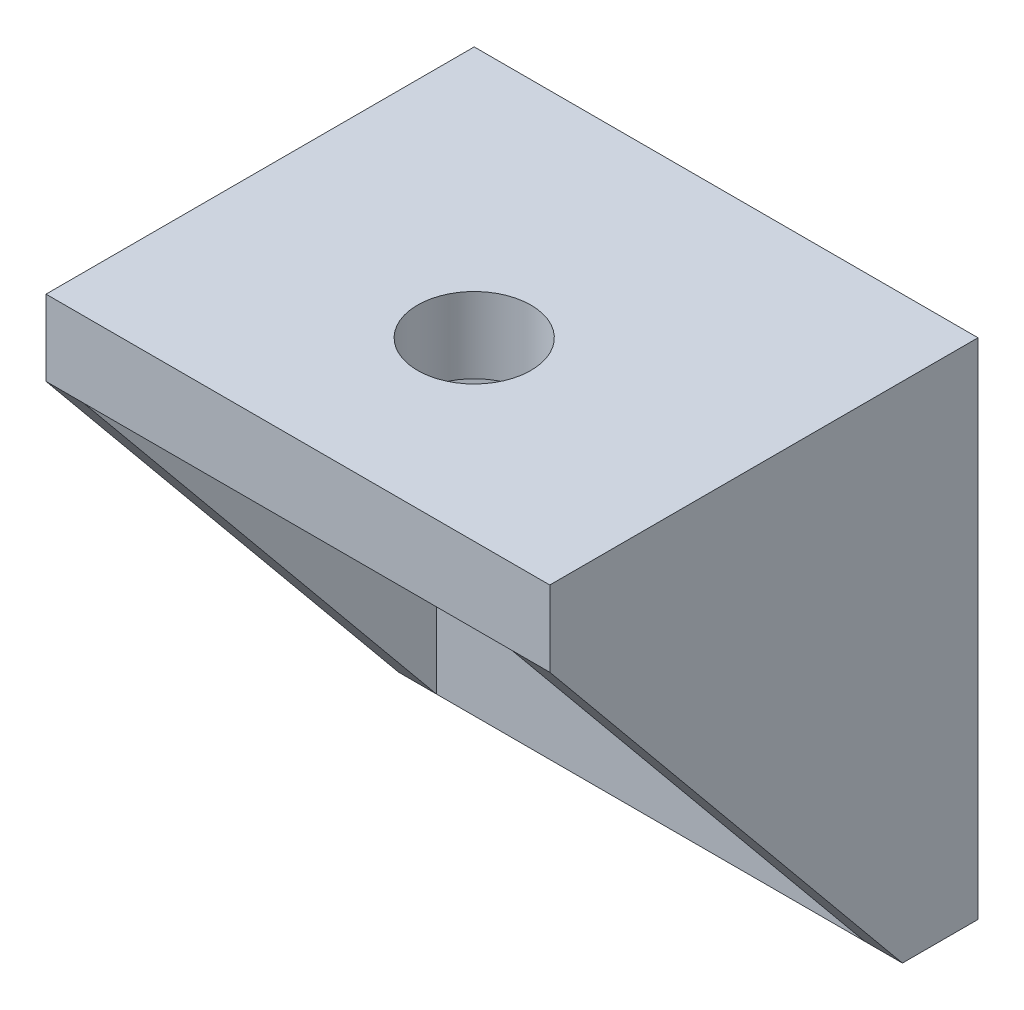
ISO-10303-21;
HEADER;
FILE_DESCRIPTION(('STEP AP214'),'2;1');
FILE_NAME('part.step','',(''),(''),'','','');
FILE_SCHEMA(('AUTOMOTIVE_DESIGN { 1 0 10303 214 1 1 1 1 }'));
ENDSEC;
DATA;
#1=APPLICATION_CONTEXT('core data for automotive mechanical design processes');
#2=APPLICATION_PROTOCOL_DEFINITION('international standard','automotive_design',2000,#1);
#3=PRODUCT_CONTEXT('',#1,'mechanical');
#4=PRODUCT('Part','Part','',(#3));
#5=PRODUCT_RELATED_PRODUCT_CATEGORY('part','',(#4));
#6=PRODUCT_DEFINITION_FORMATION('','',#4);
#7=PRODUCT_DEFINITION_CONTEXT('part definition',#1,'design');
#8=PRODUCT_DEFINITION('design','',#6,#7);
#9=PRODUCT_DEFINITION_SHAPE('','',#8);
#10=(LENGTH_UNIT() NAMED_UNIT(*) SI_UNIT(.MILLI.,.METRE.));
#11=(NAMED_UNIT(*) PLANE_ANGLE_UNIT() SI_UNIT($,.RADIAN.));
#12=(NAMED_UNIT(*) SI_UNIT($,.STERADIAN.) SOLID_ANGLE_UNIT());
#13=UNCERTAINTY_MEASURE_WITH_UNIT(LENGTH_MEASURE(1.E-05),#10,'distance_accuracy_value','');
#14=(GEOMETRIC_REPRESENTATION_CONTEXT(3) GLOBAL_UNCERTAINTY_ASSIGNED_CONTEXT((#13)) GLOBAL_UNIT_ASSIGNED_CONTEXT((#10,
#11,#12)) REPRESENTATION_CONTEXT('',''));
#15=CARTESIAN_POINT('',(0.,0.,0.));
#16=DIRECTION('',(0.,0.,1.));
#17=DIRECTION('',(1.,0.,0.));
#18=AXIS2_PLACEMENT_3D('',#15,#16,#17);
#19=CARTESIAN_POINT('',(-10.,6.99999999999999,17.));
#20=DIRECTION('',(0.,0.6357072528611,-0.77193023561705));
#21=DIRECTION('',(0.,0.77193023561705,0.6357072528611));
#22=AXIS2_PLACEMENT_3D('',#19,#20,#21);
#23=PLANE('',#22);
#24=DIRECTION('',(1.,0.,0.));
#25=VECTOR('',#24,1.);
#26=CARTESIAN_POINT('',(-9.99999999999999,-10.,3.));
#27=LINE('',#26,#25);
#28=CARTESIAN_POINT('',(-9.99999999999999,-10.,3.));
#29=VERTEX_POINT('',#28);
#30=CARTESIAN_POINT('',(-8.5,-10.,3.));
#31=VERTEX_POINT('',#30);
#32=EDGE_CURVE('E138',#29,#31,#27,.T.);
#33=ORIENTED_EDGE('',*,*,#32,.T.);
#34=DIRECTION('',(0.,0.77193023561705,0.6357072528611));
#35=VECTOR('',#34,1.);
#36=CARTESIAN_POINT('',(-8.5,6.99999999999999,17.));
#37=LINE('',#36,#35);
#38=CARTESIAN_POINT('',(-8.5,7.,17.));
#39=VERTEX_POINT('',#38);
#40=EDGE_CURVE('E47',#31,#39,#37,.T.);
#41=ORIENTED_EDGE('',*,*,#40,.T.);
#42=DIRECTION('',(1.,0.,0.));
#43=VECTOR('',#42,1.);
#44=CARTESIAN_POINT('',(-10.,6.99999999999999,17.));
#45=LINE('',#44,#43);
#46=CARTESIAN_POINT('',(-10.,6.99999999999999,17.));
#47=VERTEX_POINT('',#46);
#48=EDGE_CURVE('E150',#47,#39,#45,.T.);
#49=ORIENTED_EDGE('',*,*,#48,.F.);
#50=DIRECTION('',(0.,0.77193023561705,0.6357072528611));
#51=VECTOR('',#50,1.);
#52=CARTESIAN_POINT('',(-10.,6.99999999999999,17.));
#53=LINE('',#52,#51);
#54=EDGE_CURVE('E145',#29,#47,#53,.T.);
#55=ORIENTED_EDGE('',*,*,#54,.F.);
#56=EDGE_LOOP('',(#33,#41,#49,#55));
#57=FACE_BOUND('',#56,.T.);
#58=ADVANCED_FACE('F43',(#57),#23,.F.);
#59=CARTESIAN_POINT('',(10.,10.,17.));
#60=DIRECTION('',(-1.,0.,0.));
#61=DIRECTION('',(0.,-1.,0.));
#62=AXIS2_PLACEMENT_3D('',#59,#60,#61);
#63=PLANE('',#62);
#64=DIRECTION('',(0.,1.,0.));
#65=VECTOR('',#64,1.);
#66=CARTESIAN_POINT('',(10.,10.,17.));
#67=LINE('',#66,#65);
#68=CARTESIAN_POINT('',(10.,7.,17.));
#69=VERTEX_POINT('',#68);
#70=CARTESIAN_POINT('',(10.,10.,17.));
#71=VERTEX_POINT('',#70);
#72=EDGE_CURVE('E154',#69,#71,#67,.T.);
#73=ORIENTED_EDGE('',*,*,#72,.F.);
#74=DIRECTION('',(0.,0.77193023561705,0.6357072528611));
#75=VECTOR('',#74,1.);
#76=CARTESIAN_POINT('',(10.,7.,17.));
#77=LINE('',#76,#75);
#78=CARTESIAN_POINT('',(10.,-10.,3.));
#79=VERTEX_POINT('',#78);
#80=EDGE_CURVE('E208',#79,#69,#77,.T.);
#81=ORIENTED_EDGE('',*,*,#80,.F.);
#82=DIRECTION('',(0.,0.,-1.));
#83=VECTOR('',#82,1.);
#84=CARTESIAN_POINT('',(10.,-10.,17.));
#85=LINE('',#84,#83);
#86=CARTESIAN_POINT('',(10.,-10.,0.));
#87=VERTEX_POINT('',#86);
#88=EDGE_CURVE('E165',#79,#87,#85,.T.);
#89=ORIENTED_EDGE('',*,*,#88,.T.);
#90=DIRECTION('',(0.,1.,0.));
#91=VECTOR('',#90,1.);
#92=CARTESIAN_POINT('',(10.,10.,0.));
#93=LINE('',#92,#91);
#94=CARTESIAN_POINT('',(10.,10.,0.));
#95=VERTEX_POINT('',#94);
#96=EDGE_CURVE('E166',#87,#95,#93,.T.);
#97=ORIENTED_EDGE('',*,*,#96,.T.);
#98=DIRECTION('',(0.,0.,-1.));
#99=VECTOR('',#98,1.);
#100=CARTESIAN_POINT('',(10.,10.,17.));
#101=LINE('',#100,#99);
#102=EDGE_CURVE('E189',#71,#95,#101,.T.);
#103=ORIENTED_EDGE('',*,*,#102,.F.);
#104=EDGE_LOOP('',(#73,#81,#89,#97,#103));
#105=FACE_BOUND('',#104,.T.);
#106=ADVANCED_FACE('F45',(#105),#63,.F.);
#107=CARTESIAN_POINT('',(-10.,10.,17.));
#108=DIRECTION('',(0.,-1.,0.));
#109=DIRECTION('',(0.,0.,-1.));
#110=AXIS2_PLACEMENT_3D('',#107,#108,#109);
#111=PLANE('',#110);
#112=CARTESIAN_POINT('',(0.,10.,10.));
#113=DIRECTION('',(0.,-1.,0.));
#114=DIRECTION('',(0.,0.,-1.));
#115=AXIS2_PLACEMENT_3D('',#112,#113,#114);
#116=CIRCLE('',#115,2.25);
#117=CARTESIAN_POINT('',(0.,10.,7.75));
#118=VERTEX_POINT('',#117);
#119=EDGE_CURVE('E205',#118,#118,#116,.T.);
#120=ORIENTED_EDGE('',*,*,#119,.T.);
#121=EDGE_LOOP('',(#120));
#122=FACE_BOUND('',#121,.T.);
#123=DIRECTION('',(-1.,0.,0.));
#124=VECTOR('',#123,1.);
#125=CARTESIAN_POINT('',(-10.,10.,0.));
#126=LINE('',#125,#124);
#127=CARTESIAN_POINT('',(-10.,10.,0.));
#128=VERTEX_POINT('',#127);
#129=EDGE_CURVE('E170',#95,#128,#126,.T.);
#130=ORIENTED_EDGE('',*,*,#129,.T.);
#131=DIRECTION('',(0.,0.,-1.));
#132=VECTOR('',#131,1.);
#133=CARTESIAN_POINT('',(-10.,10.,17.));
#134=LINE('',#133,#132);
#135=CARTESIAN_POINT('',(-10.,10.,17.));
#136=VERTEX_POINT('',#135);
#137=EDGE_CURVE('E185',#136,#128,#134,.T.);
#138=ORIENTED_EDGE('',*,*,#137,.F.);
#139=DIRECTION('',(-1.,0.,0.));
#140=VECTOR('',#139,1.);
#141=CARTESIAN_POINT('',(-10.,10.,17.));
#142=LINE('',#141,#140);
#143=EDGE_CURVE('E157',#71,#136,#142,.T.);
#144=ORIENTED_EDGE('',*,*,#143,.F.);
#145=ORIENTED_EDGE('',*,*,#102,.T.);
#146=EDGE_LOOP('',(#130,#138,#144,#145));
#147=FACE_BOUND('',#146,.T.);
#148=ADVANCED_FACE('F220',(#122,#147),#111,.F.);
#149=CARTESIAN_POINT('',(-10.,10.,17.));
#150=DIRECTION('',(1.,0.,0.));
#151=DIRECTION('',(0.,0.,-1.));
#152=AXIS2_PLACEMENT_3D('',#149,#150,#151);
#153=PLANE('',#152);
#154=DIRECTION('',(0.,0.,-1.));
#155=VECTOR('',#154,1.);
#156=CARTESIAN_POINT('',(-10.,-10.,17.));
#157=LINE('',#156,#155);
#158=CARTESIAN_POINT('',(-10.,-10.,0.));
#159=VERTEX_POINT('',#158);
#160=EDGE_CURVE('E182',#29,#159,#157,.T.);
#161=ORIENTED_EDGE('',*,*,#160,.F.);
#162=ORIENTED_EDGE('',*,*,#54,.T.);
#163=DIRECTION('',(0.,-1.,0.));
#164=VECTOR('',#163,1.);
#165=CARTESIAN_POINT('',(-10.,10.,17.));
#166=LINE('',#165,#164);
#167=EDGE_CURVE('E161',#136,#47,#166,.T.);
#168=ORIENTED_EDGE('',*,*,#167,.F.);
#169=ORIENTED_EDGE('',*,*,#137,.T.);
#170=DIRECTION('',(0.,-1.,0.));
#171=VECTOR('',#170,1.);
#172=CARTESIAN_POINT('',(-10.,10.,0.));
#173=LINE('',#172,#171);
#174=EDGE_CURVE('E173',#128,#159,#173,.T.);
#175=ORIENTED_EDGE('',*,*,#174,.T.);
#176=EDGE_LOOP('',(#161,#162,#168,#169,#175));
#177=FACE_BOUND('',#176,.T.);
#178=ADVANCED_FACE('F224',(#177),#153,.F.);
#179=CARTESIAN_POINT('',(-10.,-10.,17.));
#180=DIRECTION('',(0.,1.,0.));
#181=DIRECTION('',(0.,0.,1.));
#182=AXIS2_PLACEMENT_3D('',#179,#180,#181);
#183=PLANE('',#182);
#184=ORIENTED_EDGE('',*,*,#88,.F.);
#185=CARTESIAN_POINT('',(8.50000000000001,-10.,3.));
#186=VERTEX_POINT('',#185);
#187=EDGE_CURVE('E140',#186,#79,#27,.T.);
#188=ORIENTED_EDGE('',*,*,#187,.F.);
#189=DIRECTION('',(1.,0.,0.));
#190=VECTOR('',#189,1.);
#191=CARTESIAN_POINT('',(-8.5,-10.,3.));
#192=LINE('',#191,#190);
#193=EDGE_CURVE('E127',#31,#186,#192,.T.);
#194=ORIENTED_EDGE('',*,*,#193,.F.);
#195=ORIENTED_EDGE('',*,*,#32,.F.);
#196=ORIENTED_EDGE('',*,*,#160,.T.);
#197=DIRECTION('',(1.,0.,0.));
#198=VECTOR('',#197,1.);
#199=CARTESIAN_POINT('',(-10.,-10.,0.));
#200=LINE('',#199,#198);
#201=EDGE_CURVE('E158',#159,#87,#200,.T.);
#202=ORIENTED_EDGE('',*,*,#201,.T.);
#203=EDGE_LOOP('',(#184,#188,#194,#195,#196,#202));
#204=FACE_BOUND('',#203,.T.);
#205=ADVANCED_FACE('F137',(#204),#183,.F.);
#206=CARTESIAN_POINT('',(0.,0.,17.));
#207=DIRECTION('',(0.,0.,1.));
#208=DIRECTION('',(1.,0.,0.));
#209=AXIS2_PLACEMENT_3D('',#206,#207,#208);
#210=PLANE('',#209);
#211=ORIENTED_EDGE('',*,*,#48,.T.);
#212=DIRECTION('',(-1.,0.,0.));
#213=VECTOR('',#212,1.);
#214=CARTESIAN_POINT('',(-8.5,7.,17.));
#215=LINE('',#214,#213);
#216=CARTESIAN_POINT('',(8.50000000000001,7.,17.));
#217=VERTEX_POINT('',#216);
#218=EDGE_CURVE('E131',#217,#39,#215,.T.);
#219=ORIENTED_EDGE('',*,*,#218,.F.);
#220=EDGE_CURVE('E68',#217,#69,#45,.T.);
#221=ORIENTED_EDGE('',*,*,#220,.T.);
#222=ORIENTED_EDGE('',*,*,#72,.T.);
#223=ORIENTED_EDGE('',*,*,#143,.T.);
#224=ORIENTED_EDGE('',*,*,#167,.T.);
#225=EDGE_LOOP('',(#211,#219,#221,#222,#223,#224));
#226=FACE_BOUND('',#225,.T.);
#227=ADVANCED_FACE('F217',(#226),#210,.T.);
#228=CARTESIAN_POINT('',(0.,0.,0.));
#229=DIRECTION('',(0.,0.,1.));
#230=DIRECTION('',(1.,0.,0.));
#231=AXIS2_PLACEMENT_3D('',#228,#229,#230);
#232=PLANE('',#231);
#233=CARTESIAN_POINT('',(0.,1.5,0.));
#234=DIRECTION('',(0.,0.,-1.));
#235=DIRECTION('',(-1.,0.,0.));
#236=AXIS2_PLACEMENT_3D('',#233,#234,#235);
#237=CIRCLE('',#236,2.05);
#238=CARTESIAN_POINT('',(-2.05,1.5,0.));
#239=VERTEX_POINT('',#238);
#240=EDGE_CURVE('E11',#239,#239,#237,.T.);
#241=ORIENTED_EDGE('',*,*,#240,.F.);
#242=EDGE_LOOP('',(#241));
#243=FACE_BOUND('',#242,.T.);
#244=ORIENTED_EDGE('',*,*,#96,.F.);
#245=ORIENTED_EDGE('',*,*,#201,.F.);
#246=ORIENTED_EDGE('',*,*,#174,.F.);
#247=ORIENTED_EDGE('',*,*,#129,.F.);
#248=EDGE_LOOP('',(#244,#245,#246,#247));
#249=FACE_BOUND('',#248,.T.);
#250=ADVANCED_FACE('F246',(#243,#249),#232,.F.);
#251=ORIENTED_EDGE('',*,*,#220,.F.);
#252=DIRECTION('',(0.,-0.77193023561705,-0.6357072528611));
#253=VECTOR('',#252,1.);
#254=CARTESIAN_POINT('',(8.50000000000001,7.,17.));
#255=LINE('',#254,#253);
#256=EDGE_CURVE('E121',#217,#186,#255,.T.);
#257=ORIENTED_EDGE('',*,*,#256,.T.);
#258=ORIENTED_EDGE('',*,*,#187,.T.);
#259=ORIENTED_EDGE('',*,*,#80,.T.);
#260=EDGE_LOOP('',(#251,#257,#258,#259));
#261=FACE_BOUND('',#260,.T.);
#262=ADVANCED_FACE('F194',(#261),#23,.F.);
#263=CARTESIAN_POINT('',(-8.5,7.,3.));
#264=DIRECTION('',(-1.,0.,0.));
#265=DIRECTION('',(0.,-1.,0.));
#266=AXIS2_PLACEMENT_3D('',#263,#264,#265);
#267=PLANE('',#266);
#268=DIRECTION('',(0.,-1.,0.));
#269=VECTOR('',#268,1.);
#270=CARTESIAN_POINT('',(-8.5,7.,3.));
#271=LINE('',#270,#269);
#272=CARTESIAN_POINT('',(-8.5,7.,3.));
#273=VERTEX_POINT('',#272);
#274=EDGE_CURVE('E114',#273,#31,#271,.T.);
#275=ORIENTED_EDGE('',*,*,#274,.F.);
#276=DIRECTION('',(0.,0.,1.));
#277=VECTOR('',#276,1.);
#278=CARTESIAN_POINT('',(-8.5,7.,3.));
#279=LINE('',#278,#277);
#280=EDGE_CURVE('E116',#273,#39,#279,.T.);
#281=ORIENTED_EDGE('',*,*,#280,.T.);
#282=ORIENTED_EDGE('',*,*,#40,.F.);
#283=EDGE_LOOP('',(#275,#281,#282));
#284=FACE_BOUND('',#283,.T.);
#285=ADVANCED_FACE('F113',(#284),#267,.F.);
#286=CARTESIAN_POINT('',(8.50000000000001,7.,3.));
#287=DIRECTION('',(1.,0.,0.));
#288=DIRECTION('',(0.,1.,0.));
#289=AXIS2_PLACEMENT_3D('',#286,#287,#288);
#290=PLANE('',#289);
#291=DIRECTION('',(0.,0.,1.));
#292=VECTOR('',#291,1.);
#293=CARTESIAN_POINT('',(8.50000000000001,7.,3.));
#294=LINE('',#293,#292);
#295=CARTESIAN_POINT('',(8.50000000000001,7.,3.));
#296=VERTEX_POINT('',#295);
#297=EDGE_CURVE('E60',#296,#217,#294,.T.);
#298=ORIENTED_EDGE('',*,*,#297,.F.);
#299=DIRECTION('',(0.,1.,0.));
#300=VECTOR('',#299,1.);
#301=CARTESIAN_POINT('',(8.50000000000001,7.,3.));
#302=LINE('',#301,#300);
#303=EDGE_CURVE('E142',#186,#296,#302,.T.);
#304=ORIENTED_EDGE('',*,*,#303,.F.);
#305=ORIENTED_EDGE('',*,*,#256,.F.);
#306=EDGE_LOOP('',(#298,#304,#305));
#307=FACE_BOUND('',#306,.T.);
#308=ADVANCED_FACE('F197',(#307),#290,.F.);
#309=CARTESIAN_POINT('',(-8.5,7.,3.));
#310=DIRECTION('',(0.,1.,0.));
#311=DIRECTION('',(0.,0.,1.));
#312=AXIS2_PLACEMENT_3D('',#309,#310,#311);
#313=PLANE('',#312);
#314=CARTESIAN_POINT('',(0.,7.,10.));
#315=DIRECTION('',(0.,-1.,0.));
#316=DIRECTION('',(0.,0.,-1.));
#317=AXIS2_PLACEMENT_3D('',#314,#315,#316);
#318=CIRCLE('',#317,2.24999999999999);
#319=CARTESIAN_POINT('',(0.,7.,7.75000000000001));
#320=VERTEX_POINT('',#319);
#321=EDGE_CURVE('E270',#320,#320,#318,.T.);
#322=ORIENTED_EDGE('',*,*,#321,.F.);
#323=EDGE_LOOP('',(#322));
#324=FACE_BOUND('',#323,.T.);
#325=ORIENTED_EDGE('',*,*,#218,.T.);
#326=ORIENTED_EDGE('',*,*,#280,.F.);
#327=DIRECTION('',(-1.,0.,0.));
#328=VECTOR('',#327,1.);
#329=CARTESIAN_POINT('',(-8.5,7.,3.));
#330=LINE('',#329,#328);
#331=EDGE_CURVE('E129',#296,#273,#330,.T.);
#332=ORIENTED_EDGE('',*,*,#331,.F.);
#333=ORIENTED_EDGE('',*,*,#297,.T.);
#334=EDGE_LOOP('',(#325,#326,#332,#333));
#335=FACE_BOUND('',#334,.T.);
#336=ADVANCED_FACE('F226',(#324,#335),#313,.F.);
#337=CARTESIAN_POINT('',(0.,0.,3.));
#338=DIRECTION('',(0.,0.,1.));
#339=DIRECTION('',(1.,0.,0.));
#340=AXIS2_PLACEMENT_3D('',#337,#338,#339);
#341=PLANE('',#340);
#342=ORIENTED_EDGE('',*,*,#274,.T.);
#343=ORIENTED_EDGE('',*,*,#193,.T.);
#344=ORIENTED_EDGE('',*,*,#303,.T.);
#345=ORIENTED_EDGE('',*,*,#331,.T.);
#346=EDGE_LOOP('',(#342,#343,#344,#345));
#347=FACE_BOUND('',#346,.T.);
#348=ADVANCED_FACE('F125',(#347),#341,.T.);
#349=CARTESIAN_POINT('',(0.,7.,10.));
#350=DIRECTION('',(0.,-1.,0.));
#351=DIRECTION('',(0.,0.,-1.));
#352=AXIS2_PLACEMENT_3D('',#349,#350,#351);
#353=CYLINDRICAL_SURFACE('',#352,2.24999999999999);
#354=ORIENTED_EDGE('',*,*,#119,.F.);
#355=EDGE_LOOP('',(#354));
#356=FACE_BOUND('',#355,.T.);
#357=ORIENTED_EDGE('',*,*,#321,.T.);
#358=EDGE_LOOP('',(#357));
#359=FACE_BOUND('',#358,.T.);
#360=ADVANCED_FACE('F234',(#356,#359),#353,.F.);
#361=CARTESIAN_POINT('',(0.,1.5,-5.));
#362=DIRECTION('',(0.,0.,1.));
#363=DIRECTION('',(1.,0.,0.));
#364=AXIS2_PLACEMENT_3D('',#361,#362,#363);
#365=CYLINDRICAL_SURFACE('',#364,2.05);
#366=CARTESIAN_POINT('',(0.,1.5,-5.));
#367=DIRECTION('',(0.,0.,-1.));
#368=DIRECTION('',(-1.,0.,0.));
#369=AXIS2_PLACEMENT_3D('',#366,#367,#368);
#370=CIRCLE('',#369,2.05);
#371=CARTESIAN_POINT('',(-2.05,1.5,-5.));
#372=VERTEX_POINT('',#371);
#373=EDGE_CURVE('E274',#372,#372,#370,.T.);
#374=ORIENTED_EDGE('',*,*,#373,.F.);
#375=EDGE_LOOP('',(#374));
#376=FACE_BOUND('',#375,.T.);
#377=ORIENTED_EDGE('',*,*,#240,.T.);
#378=EDGE_LOOP('',(#377));
#379=FACE_BOUND('',#378,.T.);
#380=ADVANCED_FACE('F283',(#376,#379),#365,.T.);
#381=CARTESIAN_POINT('',(0.,1.5,-5.));
#382=DIRECTION('',(0.,0.,-1.));
#383=DIRECTION('',(-1.,0.,0.));
#384=AXIS2_PLACEMENT_3D('',#381,#382,#383);
#385=PLANE('',#384);
#386=ORIENTED_EDGE('',*,*,#373,.T.);
#387=EDGE_LOOP('',(#386));
#388=FACE_BOUND('',#387,.T.);
#389=ADVANCED_FACE('F281',(#388),#385,.T.);
#390=CLOSED_SHELL('',(#58,#106,#148,#178,#205,#227,#250,#262,#285,#308,#336,#348,#360,#380,#389));
#391=MANIFOLD_SOLID_BREP('B2',#390);
#392=ADVANCED_BREP_SHAPE_REPRESENTATION('',(#18,#391),#14);
#393=SHAPE_DEFINITION_REPRESENTATION(#9,#392);
ENDSEC;
END-ISO-10303-21;
